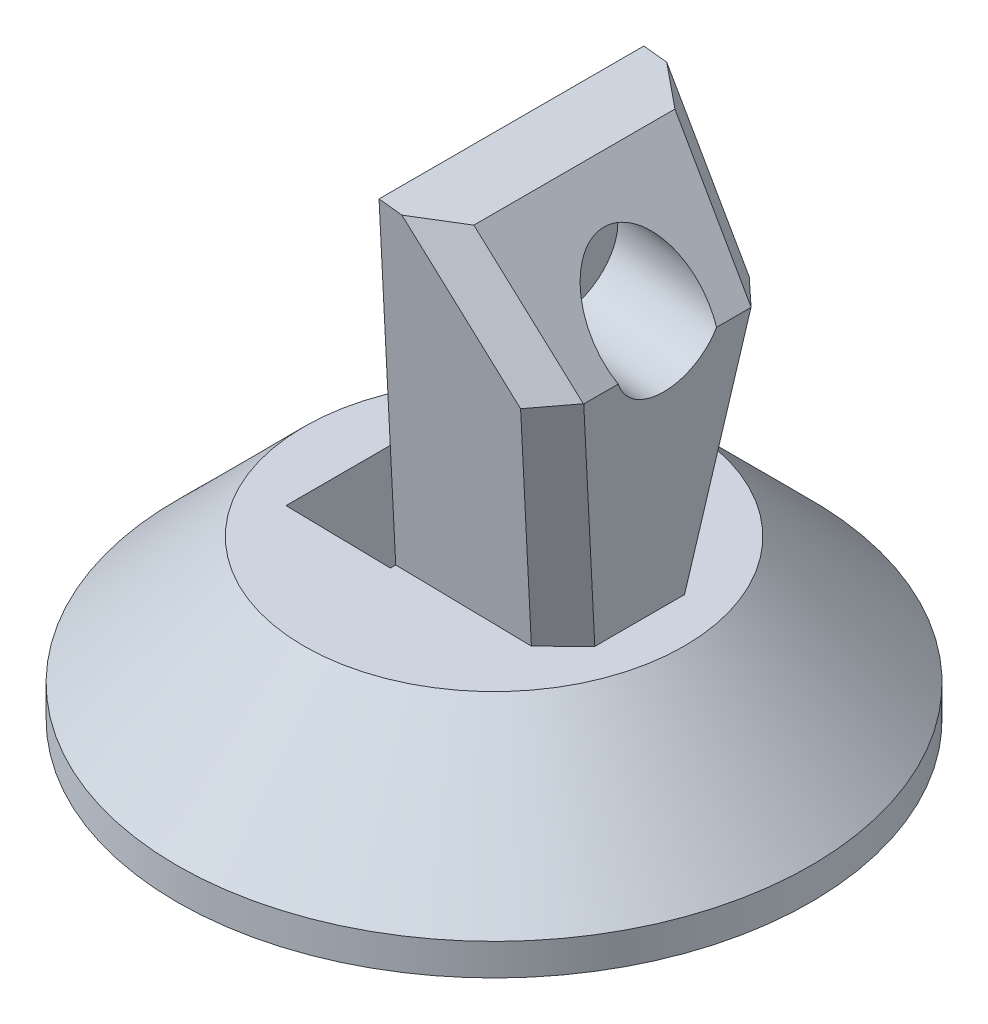
ISO-10303-21;
HEADER;
FILE_DESCRIPTION(('STEP AP214'),'2;1');
FILE_NAME('part.step','',(''),(''),'','','');
FILE_SCHEMA(('AUTOMOTIVE_DESIGN { 1 0 10303 214 1 1 1 1 }'));
ENDSEC;
DATA;
#1=APPLICATION_CONTEXT('core data for automotive mechanical design processes');
#2=APPLICATION_PROTOCOL_DEFINITION('international standard','automotive_design',2000,#1);
#3=PRODUCT_CONTEXT('',#1,'mechanical');
#4=PRODUCT('Part','Part','',(#3));
#5=PRODUCT_RELATED_PRODUCT_CATEGORY('part','',(#4));
#6=PRODUCT_DEFINITION_FORMATION('','',#4);
#7=PRODUCT_DEFINITION_CONTEXT('part definition',#1,'design');
#8=PRODUCT_DEFINITION('design','',#6,#7);
#9=PRODUCT_DEFINITION_SHAPE('','',#8);
#10=(LENGTH_UNIT() NAMED_UNIT(*) SI_UNIT(.MILLI.,.METRE.));
#11=(NAMED_UNIT(*) PLANE_ANGLE_UNIT() SI_UNIT($,.RADIAN.));
#12=(NAMED_UNIT(*) SI_UNIT($,.STERADIAN.) SOLID_ANGLE_UNIT());
#13=UNCERTAINTY_MEASURE_WITH_UNIT(LENGTH_MEASURE(1.E-05),#10,'distance_accuracy_value','');
#14=(GEOMETRIC_REPRESENTATION_CONTEXT(3) GLOBAL_UNCERTAINTY_ASSIGNED_CONTEXT((#13)) GLOBAL_UNIT_ASSIGNED_CONTEXT((#10,
#11,#12)) REPRESENTATION_CONTEXT('',''));
#15=CARTESIAN_POINT('',(0.,0.,0.));
#16=DIRECTION('',(0.,0.,1.));
#17=DIRECTION('',(1.,0.,0.));
#18=AXIS2_PLACEMENT_3D('',#15,#16,#17);
#19=CARTESIAN_POINT('',(-30.5201330251317,45.2098659765119,0.));
#20=DIRECTION('',(0.993571855676588,-0.113203213767907,0.));
#21=DIRECTION('',(0.113203213767907,0.993571855676588,0.));
#22=AXIS2_PLACEMENT_3D('',#19,#20,#21);
#23=CYLINDRICAL_SURFACE('',#22,1.5);
#24=CARTESIAN_POINT('',(0.719601570284181,41.6505478122012,0.));
#25=DIRECTION('',(0.993571855676588,-0.113203213767907,0.));
#26=DIRECTION('',(0.113203213767907,0.993571855676588,0.));
#27=AXIS2_PLACEMENT_3D('',#24,#25,#26);
#28=CIRCLE('',#27,1.5);
#29=CARTESIAN_POINT('',(0.889406390936042,43.1409055957161,0.));
#30=VERTEX_POINT('',#29);
#31=EDGE_CURVE('E190',#30,#30,#28,.T.);
#32=ORIENTED_EDGE('',*,*,#31,.F.);
#33=EDGE_LOOP('',(#32));
#34=FACE_BOUND('',#33,.T.);
#35=CARTESIAN_POINT('',(6.6810327043437,40.9713285295937,0.));
#36=DIRECTION('',(0.993571855676587,-0.113203213767907,0.));
#37=DIRECTION('',(0.113203213767907,0.993571855676587,0.));
#38=AXIS2_PLACEMENT_3D('',#35,#36,#37);
#39=CIRCLE('',#38,1.5);
#40=CARTESIAN_POINT('',(6.85083752499556,42.4616863131086,0.));
#41=VERTEX_POINT('',#40);
#42=EDGE_CURVE('E188',#41,#41,#39,.F.);
#43=ORIENTED_EDGE('',*,*,#42,.F.);
#44=EDGE_LOOP('',(#43));
#45=FACE_BOUND('',#44,.T.);
#46=ADVANCED_FACE('F32',(#34,#45),#23,.F.);
#47=CARTESIAN_POINT('',(-18.,15.,0.));
#48=DIRECTION('',(0.,1.,0.));
#49=DIRECTION('',(0.,0.,1.));
#50=AXIS2_PLACEMENT_3D('',#47,#48,#49);
#51=PLANE('',#50);
#52=DIRECTION('',(-0.999839302969671,0.,0.0179267464176493));
#53=VECTOR('',#52,1.);
#54=CARTESIAN_POINT('',(-18.1203544577285,15.,-6.7126021822961));
#55=LINE('',#54,#53);
#56=CARTESIAN_POINT('',(10.7672617188151,15.,-7.2305463841985));
#57=VERTEX_POINT('',#56);
#58=CARTESIAN_POINT('',(-2.31684480627105,15.,-6.99595322599792));
#59=VERTEX_POINT('',#58);
#60=EDGE_CURVE('E152',#57,#59,#55,.T.);
#61=ORIENTED_EDGE('',*,*,#60,.F.);
#62=DIRECTION('',(-0.711352388860831,0.,-0.702835527603713));
#63=VECTOR('',#62,1.);
#64=CARTESIAN_POINT('',(10.7997038286576,15.,-7.19849269639936));
#65=LINE('',#64,#63);
#66=CARTESIAN_POINT('',(13.7866709169119,15.,-4.24728788949617));
#67=VERTEX_POINT('',#66);
#68=EDGE_CURVE('E53',#57,#67,#65,.F.);
#69=ORIENTED_EDGE('',*,*,#68,.T.);
#70=DIRECTION('',(0.,0.,-1.));
#71=VECTOR('',#70,1.);
#72=CARTESIAN_POINT('',(13.7866709169119,15.,0.));
#73=LINE('',#72,#71);
#74=CARTESIAN_POINT('',(13.7866709169119,15.,4.24728788949617));
#75=VERTEX_POINT('',#74);
#76=EDGE_CURVE('E265',#75,#67,#73,.T.);
#77=ORIENTED_EDGE('',*,*,#76,.F.);
#78=DIRECTION('',(0.711352388860831,0.,-0.702835527603713));
#79=VECTOR('',#78,1.);
#80=CARTESIAN_POINT('',(10.0330941340627,15.,7.95592394651372));
#81=LINE('',#80,#79);
#82=CARTESIAN_POINT('',(10.7672617188151,15.,7.2305463841985));
#83=VERTEX_POINT('',#82);
#84=EDGE_CURVE('E40',#75,#83,#81,.F.);
#85=ORIENTED_EDGE('',*,*,#84,.T.);
#86=DIRECTION('',(0.999839302969671,0.,0.0179267464176493));
#87=VECTOR('',#86,1.);
#88=CARTESIAN_POINT('',(-18.1203544577285,15.,6.7126021822961));
#89=LINE('',#88,#87);
#90=CARTESIAN_POINT('',(-2.31684480627105,15.,6.99595322599792));
#91=VERTEX_POINT('',#90);
#92=EDGE_CURVE('E267',#91,#83,#89,.T.);
#93=ORIENTED_EDGE('',*,*,#92,.F.);
#94=DIRECTION('',(0.,0.,-1.));
#95=VECTOR('',#94,1.);
#96=CARTESIAN_POINT('',(-2.31684480627105,15.,0.));
#97=LINE('',#96,#95);
#98=CARTESIAN_POINT('',(-2.31684480627105,15.,7.50218578889192));
#99=VERTEX_POINT('',#98);
#100=EDGE_CURVE('E254',#99,#91,#97,.T.);
#101=ORIENTED_EDGE('',*,*,#100,.F.);
#102=DIRECTION('',(0.999839302969671,0.,0.0179267464176493));
#103=VECTOR('',#102,1.);
#104=CARTESIAN_POINT('',(-18.1294281021698,15.,7.21867205812379));
#105=LINE('',#104,#103);
#106=CARTESIAN_POINT('',(-12.3815421332604,15.,7.321729513353));
#107=VERTEX_POINT('',#106);
#108=EDGE_CURVE('E257',#107,#99,#105,.T.);
#109=ORIENTED_EDGE('',*,*,#108,.F.);
#110=DIRECTION('',(0.,0.,-1.));
#111=VECTOR('',#110,1.);
#112=CARTESIAN_POINT('',(-12.3815421332604,15.,0.));
#113=LINE('',#112,#111);
#114=CARTESIAN_POINT('',(-12.3815421332604,15.,-7.321729513353));
#115=VERTEX_POINT('',#114);
#116=EDGE_CURVE('E262',#107,#115,#113,.T.);
#117=ORIENTED_EDGE('',*,*,#116,.T.);
#118=DIRECTION('',(-0.999839302969671,0.,0.0179267464176493));
#119=VECTOR('',#118,1.);
#120=CARTESIAN_POINT('',(-18.1294281021698,15.,-7.21867205812379));
#121=LINE('',#120,#119);
#122=CARTESIAN_POINT('',(-2.31684480627105,15.,-7.50218578889192));
#123=VERTEX_POINT('',#122);
#124=EDGE_CURVE('E260',#123,#115,#121,.T.);
#125=ORIENTED_EDGE('',*,*,#124,.F.);
#126=EDGE_CURVE('E253',#59,#123,#97,.T.);
#127=ORIENTED_EDGE('',*,*,#126,.F.);
#128=EDGE_LOOP('',(#61,#69,#77,#85,#93,#101,#109,#117,#125,#127));
#129=FACE_BOUND('',#128,.T.);
#130=CARTESIAN_POINT('',(0.,15.,0.));
#131=DIRECTION('',(0.,1.,0.));
#132=DIRECTION('',(0.,0.,1.));
#133=AXIS2_PLACEMENT_3D('',#130,#131,#132);
#134=CIRCLE('',#133,18.);
#135=CARTESIAN_POINT('',(0.,15.,18.));
#136=VERTEX_POINT('',#135);
#137=EDGE_CURVE('E242',#136,#136,#134,.T.);
#138=ORIENTED_EDGE('',*,*,#137,.T.);
#139=EDGE_LOOP('',(#138));
#140=FACE_BOUND('',#139,.T.);
#141=ADVANCED_FACE('F280',(#129,#140),#51,.T.);
#142=CARTESIAN_POINT('',(0.,0.,0.));
#143=DIRECTION('',(0.,-1.,0.));
#144=DIRECTION('',(0.,0.,-1.));
#145=AXIS2_PLACEMENT_3D('',#142,#143,#144);
#146=PLANE('',#145);
#147=CARTESIAN_POINT('',(16.,0.,0.));
#148=DIRECTION('',(0.,-1.,0.));
#149=DIRECTION('',(0.,0.,-1.));
#150=AXIS2_PLACEMENT_3D('',#147,#148,#149);
#151=CIRCLE('',#150,1.75);
#152=CARTESIAN_POINT('',(16.,0.,-1.75));
#153=VERTEX_POINT('',#152);
#154=EDGE_CURVE('E194',#153,#153,#151,.T.);
#155=ORIENTED_EDGE('',*,*,#154,.F.);
#156=EDGE_LOOP('',(#155));
#157=FACE_BOUND('',#156,.T.);
#158=CARTESIAN_POINT('',(-16.,0.,0.));
#159=DIRECTION('',(0.,-1.,0.));
#160=DIRECTION('',(0.,0.,-1.));
#161=AXIS2_PLACEMENT_3D('',#158,#159,#160);
#162=CIRCLE('',#161,1.75);
#163=CARTESIAN_POINT('',(-16.,0.,-1.75));
#164=VERTEX_POINT('',#163);
#165=EDGE_CURVE('E204',#164,#164,#162,.T.);
#166=ORIENTED_EDGE('',*,*,#165,.F.);
#167=EDGE_LOOP('',(#166));
#168=FACE_BOUND('',#167,.T.);
#169=CARTESIAN_POINT('',(0.,0.,0.));
#170=DIRECTION('',(0.,1.,0.));
#171=DIRECTION('',(0.,0.,1.));
#172=AXIS2_PLACEMENT_3D('',#169,#170,#171);
#173=CIRCLE('',#172,30.);
#174=CARTESIAN_POINT('',(0.,0.,30.));
#175=VERTEX_POINT('',#174);
#176=EDGE_CURVE('E250',#175,#175,#173,.T.);
#177=ORIENTED_EDGE('',*,*,#176,.F.);
#178=EDGE_LOOP('',(#177));
#179=FACE_BOUND('',#178,.T.);
#180=ADVANCED_FACE('F336',(#157,#168,#179),#146,.T.);
#181=CARTESIAN_POINT('',(0.,15.,0.));
#182=DIRECTION('',(0.,1.,0.));
#183=DIRECTION('',(0.,0.,1.));
#184=AXIS2_PLACEMENT_3D('',#181,#182,#183);
#185=CYLINDRICAL_SURFACE('',#184,30.);
#186=ORIENTED_EDGE('',*,*,#176,.T.);
#187=EDGE_LOOP('',(#186));
#188=FACE_BOUND('',#187,.T.);
#189=CARTESIAN_POINT('',(0.,3.,0.));
#190=DIRECTION('',(0.,1.,0.));
#191=DIRECTION('',(0.,0.,1.));
#192=AXIS2_PLACEMENT_3D('',#189,#190,#191);
#193=CIRCLE('',#192,30.);
#194=CARTESIAN_POINT('',(0.,3.,30.));
#195=VERTEX_POINT('',#194);
#196=EDGE_CURVE('E247',#195,#195,#193,.T.);
#197=ORIENTED_EDGE('',*,*,#196,.F.);
#198=EDGE_LOOP('',(#197));
#199=FACE_BOUND('',#198,.T.);
#200=ADVANCED_FACE('F382',(#188,#199),#185,.T.);
#201=CARTESIAN_POINT('',(0.,15.,0.));
#202=DIRECTION('',(0.,-1.,0.));
#203=DIRECTION('',(0.,0.,-1.));
#204=AXIS2_PLACEMENT_3D('',#201,#202,#203);
#205=CONICAL_SURFACE('',#204,18.,0.78539816339745);
#206=ORIENTED_EDGE('',*,*,#196,.T.);
#207=EDGE_LOOP('',(#206));
#208=FACE_BOUND('',#207,.T.);
#209=ORIENTED_EDGE('',*,*,#137,.F.);
#210=EDGE_LOOP('',(#209));
#211=FACE_BOUND('',#210,.T.);
#212=ADVANCED_FACE('F375',(#208,#211),#205,.T.);
#213=CARTESIAN_POINT('',(-13.6835995519364,3.57198870410387,-5.5));
#214=DIRECTION('',(-0.0177088841866171,-0.155428881721793,-0.987688340595138));
#215=DIRECTION('',(0.,0.987843248824223,-0.155453259060096));
#216=AXIS2_PLACEMENT_3D('',#213,#214,#215);
#217=PLANE('',#216);
#218=ORIENTED_EDGE('',*,*,#124,.T.);
#219=DIRECTION('',(0.111809494356461,0.981339337395241,-0.156434465040228));
#220=VECTOR('',#219,1.);
#221=CARTESIAN_POINT('',(-13.6835995519364,3.57198870410387,-5.5));
#222=LINE('',#221,#220);
#223=CARTESIAN_POINT('',(-13.6835995519364,3.57198870410387,-5.5));
#224=VERTEX_POINT('',#223);
#225=EDGE_CURVE('E230',#224,#115,#222,.T.);
#226=ORIENTED_EDGE('',*,*,#225,.F.);
#227=DIRECTION('',(0.993571855676587,-0.113203213767907,0.));
#228=VECTOR('',#227,1.);
#229=CARTESIAN_POINT('',(-13.6835995519364,3.57198870410387,-5.5));
#230=LINE('',#229,#228);
#231=CARTESIAN_POINT('',(-3.74788099517054,2.4399565664248,-5.5));
#232=VERTEX_POINT('',#231);
#233=EDGE_CURVE('E240',#224,#232,#230,.T.);
#234=ORIENTED_EDGE('',*,*,#233,.T.);
#235=DIRECTION('',(0.111809494356461,0.981339337395241,-0.156434465040228));
#236=VECTOR('',#235,1.);
#237=CARTESIAN_POINT('',(-3.74788099517054,2.4399565664248,-5.5));
#238=LINE('',#237,#236);
#239=EDGE_CURVE('E227',#232,#123,#238,.T.);
#240=ORIENTED_EDGE('',*,*,#239,.T.);
#241=EDGE_LOOP('',(#218,#226,#234,#240));
#242=FACE_BOUND('',#241,.T.);
#243=ADVANCED_FACE('F285',(#242),#217,.F.);
#244=CARTESIAN_POINT('',(-13.6835995519364,3.57198870410387,5.5));
#245=DIRECTION('',(-0.113203213767907,-0.993571855676587,0.));
#246=DIRECTION('',(0.993571855676587,-0.113203213767907,0.));
#247=AXIS2_PLACEMENT_3D('',#244,#245,#246);
#248=PLANE('',#247);
#249=DIRECTION('',(0.,0.,-1.));
#250=VECTOR('',#249,1.);
#251=CARTESIAN_POINT('',(-3.74788099517054,2.4399565664248,5.5));
#252=LINE('',#251,#250);
#253=CARTESIAN_POINT('',(-3.74788099517054,2.4399565664248,5.5));
#254=VERTEX_POINT('',#253);
#255=EDGE_CURVE('E235',#254,#232,#252,.T.);
#256=ORIENTED_EDGE('',*,*,#255,.T.);
#257=ORIENTED_EDGE('',*,*,#233,.F.);
#258=DIRECTION('',(0.,0.,-1.));
#259=VECTOR('',#258,1.);
#260=CARTESIAN_POINT('',(-13.6835995519364,3.57198870410387,5.5));
#261=LINE('',#260,#259);
#262=CARTESIAN_POINT('',(-13.6835995519364,3.57198870410387,5.5));
#263=VERTEX_POINT('',#262);
#264=EDGE_CURVE('E226',#263,#224,#261,.T.);
#265=ORIENTED_EDGE('',*,*,#264,.F.);
#266=DIRECTION('',(0.993571855676587,-0.113203213767907,0.));
#267=VECTOR('',#266,1.);
#268=CARTESIAN_POINT('',(-13.6835995519364,3.57198870410387,5.5));
#269=LINE('',#268,#267);
#270=EDGE_CURVE('E233',#263,#254,#269,.T.);
#271=ORIENTED_EDGE('',*,*,#270,.T.);
#272=EDGE_LOOP('',(#256,#257,#265,#271));
#273=FACE_BOUND('',#272,.T.);
#274=ADVANCED_FACE('F292',(#273),#248,.F.);
#275=CARTESIAN_POINT('',(-11.9922036549603,18.4171799677347,7.86645925140432));
#276=DIRECTION('',(-0.0177088841866171,-0.155428881721793,0.987688340595138));
#277=DIRECTION('',(0.,-0.987843248824223,-0.155453259060096));
#278=AXIS2_PLACEMENT_3D('',#275,#276,#277);
#279=PLANE('',#278);
#280=ORIENTED_EDGE('',*,*,#108,.T.);
#281=DIRECTION('',(-0.111809494356461,-0.981339337395241,-0.156434465040228));
#282=VECTOR('',#281,1.);
#283=CARTESIAN_POINT('',(-2.05648509819448,17.2851478300557,7.86645925140432));
#284=LINE('',#283,#282);
#285=EDGE_CURVE('E222',#99,#254,#284,.T.);
#286=ORIENTED_EDGE('',*,*,#285,.T.);
#287=ORIENTED_EDGE('',*,*,#270,.F.);
#288=DIRECTION('',(-0.111809494356461,-0.981339337395241,-0.156434465040228));
#289=VECTOR('',#288,1.);
#290=CARTESIAN_POINT('',(-11.9922036549603,18.4171799677347,7.86645925140432));
#291=LINE('',#290,#289);
#292=EDGE_CURVE('E224',#107,#263,#291,.T.);
#293=ORIENTED_EDGE('',*,*,#292,.F.);
#294=EDGE_LOOP('',(#280,#286,#287,#293));
#295=FACE_BOUND('',#294,.T.);
#296=ADVANCED_FACE('F296',(#295),#279,.F.);
#297=CARTESIAN_POINT('',(-13.9100059794722,1.5848449927507,0.));
#298=DIRECTION('',(0.993571855676588,-0.113203213767907,0.));
#299=DIRECTION('',(0.113203213767907,0.993571855676588,0.));
#300=AXIS2_PLACEMENT_3D('',#297,#298,#299);
#301=PLANE('',#300);
#302=ORIENTED_EDGE('',*,*,#292,.T.);
#303=ORIENTED_EDGE('',*,*,#264,.T.);
#304=ORIENTED_EDGE('',*,*,#225,.T.);
#305=ORIENTED_EDGE('',*,*,#116,.F.);
#306=EDGE_LOOP('',(#302,#303,#304,#305));
#307=FACE_BOUND('',#306,.T.);
#308=ADVANCED_FACE('F287',(#307),#301,.T.);
#309=CARTESIAN_POINT('',(-3.97428742270635,0.452812855071628,0.));
#310=DIRECTION('',(0.993571855676588,-0.113203213767907,0.));
#311=DIRECTION('',(0.113203213767907,0.993571855676588,0.));
#312=AXIS2_PLACEMENT_3D('',#309,#310,#311);
#313=PLANE('',#312);
#314=ORIENTED_EDGE('',*,*,#31,.T.);
#315=EDGE_LOOP('',(#314));
#316=FACE_BOUND('',#315,.T.);
#317=ORIENTED_EDGE('',*,*,#100,.T.);
#318=DIRECTION('',(0.111809494356461,0.981339337395241,0.156434465040228));
#319=VECTOR('',#318,1.);
#320=CARTESIAN_POINT('',(1.64526767560569,49.7750149486806,12.5394086373566));
#321=LINE('',#320,#319);
#322=CARTESIAN_POINT('',(1.64526767560569,49.7750149486806,12.5394086373566));
#323=VERTEX_POINT('',#322);
#324=EDGE_CURVE('E184',#91,#323,#321,.T.);
#325=ORIENTED_EDGE('',*,*,#324,.T.);
#326=DIRECTION('',(0.,0.,-1.));
#327=VECTOR('',#326,1.);
#328=CARTESIAN_POINT('',(1.64526767560569,49.7750149486806,-12.5394086373566));
#329=LINE('',#328,#327);
#330=CARTESIAN_POINT('',(1.64526767560569,49.7750149486806,-12.5394086373566));
#331=VERTEX_POINT('',#330);
#332=EDGE_CURVE('E213',#323,#331,#329,.T.);
#333=ORIENTED_EDGE('',*,*,#332,.T.);
#334=DIRECTION('',(-0.111809494356461,-0.981339337395241,0.156434465040228));
#335=VECTOR('',#334,1.);
#336=CARTESIAN_POINT('',(-2.31684480627105,15.,-6.99595322599792));
#337=LINE('',#336,#335);
#338=EDGE_CURVE('E216',#331,#59,#337,.T.);
#339=ORIENTED_EDGE('',*,*,#338,.T.);
#340=ORIENTED_EDGE('',*,*,#126,.T.);
#341=ORIENTED_EDGE('',*,*,#239,.F.);
#342=ORIENTED_EDGE('',*,*,#255,.F.);
#343=ORIENTED_EDGE('',*,*,#285,.F.);
#344=EDGE_LOOP('',(#317,#325,#333,#339,#340,#341,#342,#343));
#345=FACE_BOUND('',#344,.T.);
#346=ADVANCED_FACE('F276',(#316,#345),#313,.F.);
#347=CARTESIAN_POINT('',(13.5803048845543,13.1887485797135,-6.99595322599792));
#348=DIRECTION('',(-0.0177088841866171,-0.155428881721793,-0.987688340595138));
#349=DIRECTION('',(0.,0.987843248824223,-0.155453259060096));
#350=AXIS2_PLACEMENT_3D('',#347,#348,#349);
#351=PLANE('',#350);
#352=DIRECTION('',(-0.993571855676587,0.113203213767907,0.));
#353=VECTOR('',#352,1.);
#354=CARTESIAN_POINT('',(17.5424173664311,47.963763528394,-12.5394086373566));
#355=LINE('',#354,#353);
#356=CARTESIAN_POINT('',(3.8135083072438,49.5279751333705,-12.5394086373566));
#357=VERTEX_POINT('',#356);
#358=EDGE_CURVE('E220',#357,#331,#355,.T.);
#359=ORIENTED_EDGE('',*,*,#358,.F.);
#360=DIRECTION('',(0.618646939595432,-0.777745795270369,0.111298886195985));
#361=VECTOR('',#360,1.);
#362=CARTESIAN_POINT('',(25.4178100473883,22.3676454481742,-8.652644528748));
#363=LINE('',#362,#361);
#364=CARTESIAN_POINT('',(13.3370998357286,37.5551796775402,-10.8260482990689));
#365=VERTEX_POINT('',#364);
#366=EDGE_CURVE('E157',#357,#365,#363,.T.);
#367=ORIENTED_EDGE('',*,*,#366,.T.);
#368=DIRECTION('',(-0.111809494356461,-0.981339337395241,0.156434465040228));
#369=VECTOR('',#368,1.);
#370=CARTESIAN_POINT('',(10.5995893175246,13.5283582210172,-6.99595322599792));
#371=LINE('',#370,#369);
#372=EDGE_CURVE('E150',#365,#57,#371,.T.);
#373=ORIENTED_EDGE('',*,*,#372,.T.);
#374=ORIENTED_EDGE('',*,*,#60,.T.);
#375=ORIENTED_EDGE('',*,*,#338,.F.);
#376=EDGE_LOOP('',(#359,#367,#373,#374,#375));
#377=FACE_BOUND('',#376,.T.);
#378=ADVANCED_FACE('F272',(#377),#351,.T.);
#379=CARTESIAN_POINT('',(17.5424173664311,47.963763528394,-12.5394086373566));
#380=DIRECTION('',(0.113203213767907,0.993571855676587,0.));
#381=DIRECTION('',(-0.993571855676587,0.113203213767907,0.));
#382=AXIS2_PLACEMENT_3D('',#379,#380,#381);
#383=PLANE('',#382);
#384=DIRECTION('',(0.,0.,-1.));
#385=VECTOR('',#384,1.);
#386=CARTESIAN_POINT('',(7.60669880966522,49.0957956660731,-12.5394086373566));
#387=LINE('',#386,#385);
#388=CARTESIAN_POINT('',(7.60669880966522,49.0957956660731,9.52065304287462));
#389=VERTEX_POINT('',#388);
#390=CARTESIAN_POINT('',(7.60669880966522,49.0957956660731,-9.52065304287458));
#391=VERTEX_POINT('',#390);
#392=EDGE_CURVE('E148',#389,#391,#387,.T.);
#393=ORIENTED_EDGE('',*,*,#392,.T.);
#394=DIRECTION('',(-0.779364889072096,0.0887974127253738,-0.620246232697079));
#395=VECTOR('',#394,1.);
#396=CARTESIAN_POINT('',(12.2608320638694,48.5655241626384,-5.81672865794725));
#397=LINE('',#396,#395);
#398=EDGE_CURVE('E169',#391,#357,#397,.T.);
#399=ORIENTED_EDGE('',*,*,#398,.T.);
#400=ORIENTED_EDGE('',*,*,#358,.T.);
#401=ORIENTED_EDGE('',*,*,#332,.F.);
#402=DIRECTION('',(-0.993571855676587,0.113203213767907,0.));
#403=VECTOR('',#402,1.);
#404=CARTESIAN_POINT('',(17.5424173664311,47.963763528394,12.5394086373566));
#405=LINE('',#404,#403);
#406=CARTESIAN_POINT('',(3.81350830724381,49.5279751333705,12.5394086373566));
#407=VERTEX_POINT('',#406);
#408=EDGE_CURVE('E219',#407,#323,#405,.T.);
#409=ORIENTED_EDGE('',*,*,#408,.F.);
#410=DIRECTION('',(0.779364889072099,-0.0887974127253744,-0.620246232697076));
#411=VECTOR('',#410,1.);
#412=CARTESIAN_POINT('',(24.383885596161,47.1842766839634,-3.83122750176783));
#413=LINE('',#412,#411);
#414=EDGE_CURVE('E167',#407,#389,#413,.T.);
#415=ORIENTED_EDGE('',*,*,#414,.T.);
#416=EDGE_LOOP('',(#393,#399,#400,#401,#409,#415));
#417=FACE_BOUND('',#416,.T.);
#418=ADVANCED_FACE('F310',(#417),#383,.T.);
#419=CARTESIAN_POINT('',(17.5424173664311,47.963763528394,12.5394086373566));
#420=DIRECTION('',(-0.0177088841866171,-0.155428881721793,0.987688340595138));
#421=DIRECTION('',(0.,-0.987843248824223,-0.155453259060096));
#422=AXIS2_PLACEMENT_3D('',#419,#420,#421);
#423=PLANE('',#422);
#424=DIRECTION('',(0.111809494356461,0.981339337395241,0.156434465040228));
#425=VECTOR('',#424,1.);
#426=CARTESIAN_POINT('',(14.5617017994013,48.3033731696978,12.5394086373566));
#427=LINE('',#426,#425);
#428=CARTESIAN_POINT('',(13.3370998357286,37.5551796775402,10.8260482990689));
#429=VERTEX_POINT('',#428);
#430=EDGE_CURVE('E171',#83,#429,#427,.T.);
#431=ORIENTED_EDGE('',*,*,#430,.T.);
#432=DIRECTION('',(-0.618646939595433,0.777745795270369,0.111298886195985));
#433=VECTOR('',#432,1.);
#434=CARTESIAN_POINT('',(9.82051229185196,41.9761361244254,11.458706850811));
#435=LINE('',#434,#433);
#436=EDGE_CURVE('E173',#429,#407,#435,.T.);
#437=ORIENTED_EDGE('',*,*,#436,.T.);
#438=ORIENTED_EDGE('',*,*,#408,.T.);
#439=ORIENTED_EDGE('',*,*,#324,.F.);
#440=ORIENTED_EDGE('',*,*,#92,.T.);
#441=EDGE_LOOP('',(#431,#437,#438,#439,#440));
#442=FACE_BOUND('',#441,.T.);
#443=ADVANCED_FACE('F301',(#442),#423,.T.);
#444=CARTESIAN_POINT('',(11.9228622681191,-1.35843856521488,0.));
#445=DIRECTION('',(0.993571855676587,-0.113203213767907,0.));
#446=DIRECTION('',(0.113203213767907,0.993571855676587,0.));
#447=AXIS2_PLACEMENT_3D('',#444,#445,#446);
#448=PLANE('',#447);
#449=CARTESIAN_POINT('',(16.6167512611096,39.8392963919147,0.));
#450=DIRECTION('',(0.993571855676587,-0.113203213767907,0.));
#451=DIRECTION('',(0.113203213767907,0.993571855676587,0.));
#452=AXIS2_PLACEMENT_3D('',#449,#450,#451);
#453=CIRCLE('',#452,5.);
#454=CARTESIAN_POINT('',(16.410385228752,38.0280449716281,4.65583304610454));
#455=VERTEX_POINT('',#454);
#456=CARTESIAN_POINT('',(16.410385228752,38.0280449716281,-4.65583304610454));
#457=VERTEX_POINT('',#456);
#458=EDGE_CURVE('E45',#455,#457,#453,.T.);
#459=ORIENTED_EDGE('',*,*,#458,.F.);
#460=DIRECTION('',(0.,0.,1.));
#461=VECTOR('',#460,1.);
#462=CARTESIAN_POINT('',(16.410385228752,38.0280449716281,0.));
#463=LINE('',#462,#461);
#464=CARTESIAN_POINT('',(16.410385228752,38.0280449716281,7.91816885674723));
#465=VERTEX_POINT('',#464);
#466=EDGE_CURVE('E139',#455,#465,#463,.T.);
#467=ORIENTED_EDGE('',*,*,#466,.T.);
#468=DIRECTION('',(-0.111809494356461,-0.981339337395241,-0.156434465040228));
#469=VECTOR('',#468,1.);
#470=CARTESIAN_POINT('',(11.8941842010222,-1.61014272973667,1.59947923335376));
#471=LINE('',#470,#469);
#472=EDGE_CURVE('E176',#465,#75,#471,.T.);
#473=ORIENTED_EDGE('',*,*,#472,.T.);
#474=ORIENTED_EDGE('',*,*,#76,.T.);
#475=DIRECTION('',(0.111809494356461,0.981339337395241,-0.156434465040228));
#476=VECTOR('',#475,1.);
#477=CARTESIAN_POINT('',(11.8941842010222,-1.61014272973667,-1.59947923335376));
#478=LINE('',#477,#476);
#479=CARTESIAN_POINT('',(16.410385228752,38.0280449716281,-7.91816885674723));
#480=VERTEX_POINT('',#479);
#481=EDGE_CURVE('E178',#67,#480,#478,.T.);
#482=ORIENTED_EDGE('',*,*,#481,.T.);
#483=EDGE_CURVE('E141',#480,#457,#463,.T.);
#484=ORIENTED_EDGE('',*,*,#483,.T.);
#485=EDGE_LOOP('',(#459,#467,#473,#474,#482,#484));
#486=FACE_BOUND('',#485,.T.);
#487=ADVANCED_FACE('F138',(#486),#448,.T.);
#488=CARTESIAN_POINT('',(7.60669880966522,49.0957956660731,-12.5394086373566));
#489=DIRECTION('',(-0.782608156852415,-0.622514636637618,0.));
#490=DIRECTION('',(0.,0.,-1.));
#491=AXIS2_PLACEMENT_3D('',#488,#489,#490);
#492=PLANE('',#491);
#493=CARTESIAN_POINT('',(14.8054998408231,40.0456624242722,0.));
#494=DIRECTION('',(-0.782608156852415,-0.622514636637618,0.));
#495=DIRECTION('',(0.622514636637618,-0.782608156852415,0.));
#496=AXIS2_PLACEMENT_3D('',#493,#494,#495);
#497=ELLIPSE('',#496,7.07106781186546,5.);
#498=EDGE_CURVE('E11',#457,#455,#497,.F.);
#499=ORIENTED_EDGE('',*,*,#498,.F.);
#500=ORIENTED_EDGE('',*,*,#483,.F.);
#501=DIRECTION('',(-0.479504136343916,0.602819317428631,-0.637718318510574));
#502=VECTOR('',#501,1.);
#503=CARTESIAN_POINT('',(9.77390066156414,46.3712495316999,-16.7443863139684));
#504=LINE('',#503,#502);
#505=CARTESIAN_POINT('',(16.3941773812683,38.0484210285097,-7.93972454409286));
#506=VERTEX_POINT('',#505);
#507=EDGE_CURVE('E163',#480,#506,#504,.T.);
#508=ORIENTED_EDGE('',*,*,#507,.T.);
#509=DIRECTION('',(0.618646939595432,-0.777745795270369,0.111298886195985));
#510=VECTOR('',#509,1.);
#511=CARTESIAN_POINT('',(7.39884325256982,49.3571059146298,-9.55804770292009));
#512=LINE('',#511,#510);
#513=EDGE_CURVE('E165',#506,#391,#512,.F.);
#514=ORIENTED_EDGE('',*,*,#513,.T.);
#515=ORIENTED_EDGE('',*,*,#392,.F.);
#516=DIRECTION('',(-0.618646939595432,0.777745795270369,0.111298886195985));
#517=VECTOR('',#516,1.);
#518=CARTESIAN_POINT('',(9.1256380767211,47.1862272957902,9.24738530678395));
#519=LINE('',#518,#517);
#520=CARTESIAN_POINT('',(16.3941773812683,38.0484210285098,7.93972454409291));
#521=VERTEX_POINT('',#520);
#522=EDGE_CURVE('E161',#389,#521,#519,.F.);
#523=ORIENTED_EDGE('',*,*,#522,.T.);
#524=DIRECTION('',(0.479504136343916,-0.602819317428632,-0.637718318510574));
#525=VECTOR('',#524,1.);
#526=CARTESIAN_POINT('',(17.4427163721147,36.7302268548813,6.54521619379222));
#527=LINE('',#526,#525);
#528=EDGE_CURVE('E146',#521,#465,#527,.T.);
#529=ORIENTED_EDGE('',*,*,#528,.T.);
#530=ORIENTED_EDGE('',*,*,#466,.F.);
#531=EDGE_LOOP('',(#499,#500,#508,#514,#515,#523,#529,#530));
#532=FACE_BOUND('',#531,.T.);
#533=ADVANCED_FACE('F144',(#532),#492,.F.);
#534=CARTESIAN_POINT('',(10.5995893175246,13.5283582210172,-6.99595322599792));
#535=DIRECTION('',(-0.690039324649413,0.189951576365119,0.69840112333371));
#536=DIRECTION('',(-0.111809494356461,-0.981339337395241,0.156434465040228));
#537=AXIS2_PLACEMENT_3D('',#534,#535,#536);
#538=PLANE('',#537);
#539=ORIENTED_EDGE('',*,*,#68,.F.);
#540=ORIENTED_EDGE('',*,*,#372,.F.);
#541=DIRECTION('',(-0.722169209024864,-0.116517723538846,-0.681832276764401));
#542=VECTOR('',#541,1.);
#543=CARTESIAN_POINT('',(11.773593458795,37.3029171862817,-12.3022246569058));
#544=LINE('',#543,#542);
#545=EDGE_CURVE('E182',#506,#365,#544,.T.);
#546=ORIENTED_EDGE('',*,*,#545,.F.);
#547=ORIENTED_EDGE('',*,*,#507,.F.);
#548=ORIENTED_EDGE('',*,*,#481,.F.);
#549=EDGE_LOOP('',(#539,#540,#546,#547,#548));
#550=FACE_BOUND('',#549,.T.);
#551=ADVANCED_FACE('F320',(#550),#538,.F.);
#552=CARTESIAN_POINT('',(25.4178100473883,22.3676454481742,-8.652644528748));
#553=DIRECTION('',(0.602379559365404,0.378592904705013,-0.702713511301557));
#554=DIRECTION('',(-0.618646939595433,0.777745795270369,-0.111298886195985));
#555=AXIS2_PLACEMENT_3D('',#552,#553,#554);
#556=PLANE('',#555);
#557=ORIENTED_EDGE('',*,*,#398,.F.);
#558=ORIENTED_EDGE('',*,*,#513,.F.);
#559=ORIENTED_EDGE('',*,*,#545,.T.);
#560=ORIENTED_EDGE('',*,*,#366,.F.);
#561=EDGE_LOOP('',(#557,#558,#559,#560));
#562=FACE_BOUND('',#561,.T.);
#563=ADVANCED_FACE('F315',(#562),#556,.T.);
#564=CARTESIAN_POINT('',(14.5617017994013,48.3033731696978,12.5394086373566));
#565=DIRECTION('',(-0.690039324649413,0.189951576365119,-0.69840112333371));
#566=DIRECTION('',(0.111809494356461,0.981339337395241,0.156434465040228));
#567=AXIS2_PLACEMENT_3D('',#564,#565,#566);
#568=PLANE('',#567);
#569=ORIENTED_EDGE('',*,*,#472,.F.);
#570=ORIENTED_EDGE('',*,*,#528,.F.);
#571=DIRECTION('',(0.722169209024865,0.116517723538853,-0.6818322767644));
#572=VECTOR('',#571,1.);
#573=CARTESIAN_POINT('',(14.0365210677844,37.6680271497606,10.1656934056307));
#574=LINE('',#573,#572);
#575=EDGE_CURVE('E185',#429,#521,#574,.T.);
#576=ORIENTED_EDGE('',*,*,#575,.F.);
#577=ORIENTED_EDGE('',*,*,#430,.F.);
#578=ORIENTED_EDGE('',*,*,#84,.F.);
#579=EDGE_LOOP('',(#569,#570,#576,#577,#578));
#580=FACE_BOUND('',#579,.T.);
#581=ADVANCED_FACE('F34',(#580),#568,.F.);
#582=CARTESIAN_POINT('',(9.82051229185196,41.9761361244254,11.458706850811));
#583=DIRECTION('',(0.602379559365401,0.378592904705011,0.70271351130156));
#584=DIRECTION('',(0.618646939595432,-0.777745795270369,-0.111298886195985));
#585=AXIS2_PLACEMENT_3D('',#582,#583,#584);
#586=PLANE('',#585);
#587=ORIENTED_EDGE('',*,*,#575,.T.);
#588=ORIENTED_EDGE('',*,*,#522,.F.);
#589=ORIENTED_EDGE('',*,*,#414,.F.);
#590=ORIENTED_EDGE('',*,*,#436,.F.);
#591=EDGE_LOOP('',(#587,#588,#589,#590));
#592=FACE_BOUND('',#591,.T.);
#593=ADVANCED_FACE('F307',(#592),#586,.T.);
#594=CARTESIAN_POINT('',(-16.,11.,0.));
#595=DIRECTION('',(0.,-1.,0.));
#596=DIRECTION('',(0.,0.,-1.));
#597=AXIS2_PLACEMENT_3D('',#594,#595,#596);
#598=CYLINDRICAL_SURFACE('',#597,1.75);
#599=CARTESIAN_POINT('',(-16.,11.,0.));
#600=DIRECTION('',(0.,-1.,0.));
#601=DIRECTION('',(0.,0.,-1.));
#602=AXIS2_PLACEMENT_3D('',#599,#600,#601);
#603=CIRCLE('',#602,1.75);
#604=CARTESIAN_POINT('',(-16.,11.,-1.75));
#605=VERTEX_POINT('',#604);
#606=EDGE_CURVE('E187',#605,#605,#603,.T.);
#607=ORIENTED_EDGE('',*,*,#606,.F.);
#608=EDGE_LOOP('',(#607));
#609=FACE_BOUND('',#608,.T.);
#610=ORIENTED_EDGE('',*,*,#165,.T.);
#611=EDGE_LOOP('',(#610));
#612=FACE_BOUND('',#611,.T.);
#613=ADVANCED_FACE('F355',(#609,#612),#598,.F.);
#614=CARTESIAN_POINT('',(-16.,11.,0.));
#615=DIRECTION('',(0.,-1.,0.));
#616=DIRECTION('',(0.,0.,-1.));
#617=AXIS2_PLACEMENT_3D('',#614,#615,#616);
#618=PLANE('',#617);
#619=ORIENTED_EDGE('',*,*,#606,.T.);
#620=EDGE_LOOP('',(#619));
#621=FACE_BOUND('',#620,.T.);
#622=ADVANCED_FACE('F351',(#621),#618,.T.);
#623=CARTESIAN_POINT('',(16.,11.,0.));
#624=DIRECTION('',(0.,-1.,0.));
#625=DIRECTION('',(0.,0.,-1.));
#626=AXIS2_PLACEMENT_3D('',#623,#624,#625);
#627=CYLINDRICAL_SURFACE('',#626,1.75);
#628=CARTESIAN_POINT('',(16.,11.,0.));
#629=DIRECTION('',(0.,-1.,0.));
#630=DIRECTION('',(0.,0.,-1.));
#631=AXIS2_PLACEMENT_3D('',#628,#629,#630);
#632=CIRCLE('',#631,1.75);
#633=CARTESIAN_POINT('',(16.,11.,-1.75));
#634=VERTEX_POINT('',#633);
#635=EDGE_CURVE('E201',#634,#634,#632,.T.);
#636=ORIENTED_EDGE('',*,*,#635,.F.);
#637=EDGE_LOOP('',(#636));
#638=FACE_BOUND('',#637,.T.);
#639=ORIENTED_EDGE('',*,*,#154,.T.);
#640=EDGE_LOOP('',(#639));
#641=FACE_BOUND('',#640,.T.);
#642=ADVANCED_FACE('F347',(#638,#641),#627,.F.);
#643=CARTESIAN_POINT('',(16.,11.,0.));
#644=DIRECTION('',(0.,-1.,0.));
#645=DIRECTION('',(0.,0.,-1.));
#646=AXIS2_PLACEMENT_3D('',#643,#644,#645);
#647=PLANE('',#646);
#648=ORIENTED_EDGE('',*,*,#635,.T.);
#649=EDGE_LOOP('',(#648));
#650=FACE_BOUND('',#649,.T.);
#651=ADVANCED_FACE('F343',(#650),#647,.T.);
#652=CARTESIAN_POINT('',(6.6810327043437,40.9713285295937,0.));
#653=DIRECTION('',(0.993571855676587,-0.113203213767907,0.));
#654=DIRECTION('',(0.113203213767907,0.993571855676587,0.));
#655=AXIS2_PLACEMENT_3D('',#652,#653,#654);
#656=PLANE('',#655);
#657=CARTESIAN_POINT('',(6.6810327043437,40.9713285295937,0.));
#658=DIRECTION('',(0.993571855676587,-0.113203213767907,0.));
#659=DIRECTION('',(0.113203213767907,0.993571855676587,0.));
#660=AXIS2_PLACEMENT_3D('',#657,#658,#659);
#661=CIRCLE('',#660,5.);
#662=CARTESIAN_POINT('',(7.24704877318324,45.9391878079767,0.));
#663=VERTEX_POINT('',#662);
#664=EDGE_CURVE('E142',#663,#663,#661,.T.);
#665=ORIENTED_EDGE('',*,*,#664,.T.);
#666=EDGE_LOOP('',(#665));
#667=FACE_BOUND('',#666,.T.);
#668=ORIENTED_EDGE('',*,*,#42,.T.);
#669=EDGE_LOOP('',(#668));
#670=FACE_BOUND('',#669,.T.);
#671=ADVANCED_FACE('F346',(#667,#670),#656,.T.);
#672=CARTESIAN_POINT('',(6.6810327043437,40.9713285295937,0.));
#673=DIRECTION('',(0.993571855676587,-0.113203213767907,0.));
#674=DIRECTION('',(0.113203213767907,0.993571855676587,0.));
#675=AXIS2_PLACEMENT_3D('',#672,#673,#674);
#676=CYLINDRICAL_SURFACE('',#675,5.);
#677=ORIENTED_EDGE('',*,*,#498,.T.);
#678=ORIENTED_EDGE('',*,*,#458,.T.);
#679=EDGE_LOOP('',(#677,#678));
#680=FACE_BOUND('',#679,.T.);
#681=ORIENTED_EDGE('',*,*,#664,.F.);
#682=EDGE_LOOP('',(#681));
#683=FACE_BOUND('',#682,.T.);
#684=ADVANCED_FACE('F131',(#680,#683),#676,.F.);
#685=CLOSED_SHELL('',(#46,#141,#180,#200,#212,#243,#274,#296,#308,#346,#378,#418,#443,#487,#533,
#551,#563,#581,#593,#613,#622,#642,#651,#671,#684));
#686=MANIFOLD_SOLID_BREP('B2',#685);
#687=ADVANCED_BREP_SHAPE_REPRESENTATION('',(#18,#686),#14);
#688=SHAPE_DEFINITION_REPRESENTATION(#9,#687);
ENDSEC;
END-ISO-10303-21;
